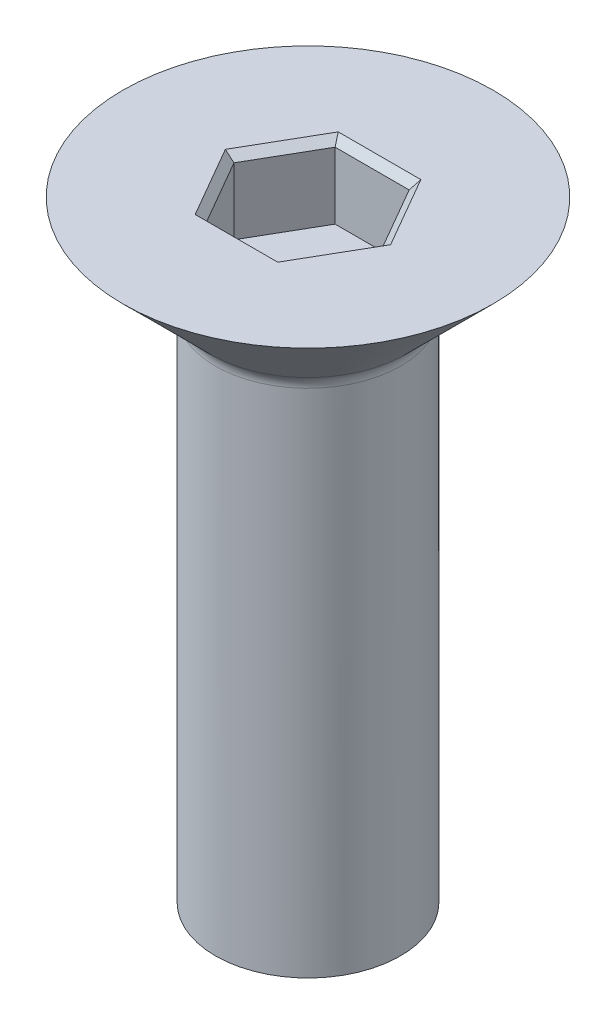
ISO-10303-21;
HEADER;
FILE_DESCRIPTION(('STEP AP214'),'2;1');
FILE_NAME('part.step','',(''),(''),'','','');
FILE_SCHEMA(('AUTOMOTIVE_DESIGN { 1 0 10303 214 1 1 1 1 }'));
ENDSEC;
DATA;
#1=APPLICATION_CONTEXT('core data for automotive mechanical design processes');
#2=APPLICATION_PROTOCOL_DEFINITION('international standard','automotive_design',2000,#1);
#3=PRODUCT_CONTEXT('',#1,'mechanical');
#4=PRODUCT('Part','Part','',(#3));
#5=PRODUCT_RELATED_PRODUCT_CATEGORY('part','',(#4));
#6=PRODUCT_DEFINITION_FORMATION('','',#4);
#7=PRODUCT_DEFINITION_CONTEXT('part definition',#1,'design');
#8=PRODUCT_DEFINITION('design','',#6,#7);
#9=PRODUCT_DEFINITION_SHAPE('','',#8);
#10=(LENGTH_UNIT() NAMED_UNIT(*) SI_UNIT(.MILLI.,.METRE.));
#11=(NAMED_UNIT(*) PLANE_ANGLE_UNIT() SI_UNIT($,.RADIAN.));
#12=(NAMED_UNIT(*) SI_UNIT($,.STERADIAN.) SOLID_ANGLE_UNIT());
#13=UNCERTAINTY_MEASURE_WITH_UNIT(LENGTH_MEASURE(1.E-05),#10,'distance_accuracy_value','');
#14=(GEOMETRIC_REPRESENTATION_CONTEXT(3) GLOBAL_UNCERTAINTY_ASSIGNED_CONTEXT((#13)) GLOBAL_UNIT_ASSIGNED_CONTEXT((#10,
#11,#12)) REPRESENTATION_CONTEXT('',''));
#15=CARTESIAN_POINT('',(0.,0.,0.));
#16=DIRECTION('',(0.,0.,1.));
#17=DIRECTION('',(1.,0.,0.));
#18=AXIS2_PLACEMENT_3D('',#15,#16,#17);
#19=CARTESIAN_POINT('',(0.,14.,0.));
#20=DIRECTION('',(0.,-1.,0.));
#21=DIRECTION('',(0.,0.,-1.));
#22=AXIS2_PLACEMENT_3D('',#19,#20,#21);
#23=CYLINDRICAL_SURFACE('',#22,2.5);
#24=CARTESIAN_POINT('',(0.,13.7928932188135,0.));
#25=DIRECTION('',(0.,1.,0.));
#26=DIRECTION('',(-1.,0.,0.));
#27=AXIS2_PLACEMENT_3D('',#24,#25,#26);
#28=CIRCLE('',#27,2.5);
#29=CARTESIAN_POINT('',(-2.5,13.7928932188135,0.));
#30=VERTEX_POINT('',#29);
#31=EDGE_CURVE('E11',#30,#30,#28,.F.);
#32=ORIENTED_EDGE('',*,*,#31,.T.);
#33=EDGE_LOOP('',(#32));
#34=FACE_BOUND('',#33,.T.);
#35=CARTESIAN_POINT('',(0.,0.,0.));
#36=DIRECTION('',(0.,1.,0.));
#37=DIRECTION('',(0.,0.,1.));
#38=AXIS2_PLACEMENT_3D('',#35,#36,#37);
#39=CIRCLE('',#38,2.5);
#40=CARTESIAN_POINT('',(0.,0.,2.5));
#41=VERTEX_POINT('',#40);
#42=EDGE_CURVE('E157',#41,#41,#39,.T.);
#43=ORIENTED_EDGE('',*,*,#42,.T.);
#44=EDGE_LOOP('',(#43));
#45=FACE_BOUND('',#44,.T.);
#46=ADVANCED_FACE('F38',(#34,#45),#23,.T.);
#47=CARTESIAN_POINT('',(0.,0.,0.));
#48=DIRECTION('',(0.,1.,0.));
#49=DIRECTION('',(0.,0.,1.));
#50=AXIS2_PLACEMENT_3D('',#47,#48,#49);
#51=PLANE('',#50);
#52=ORIENTED_EDGE('',*,*,#42,.F.);
#53=EDGE_LOOP('',(#52));
#54=FACE_BOUND('',#53,.T.);
#55=ADVANCED_FACE('F212',(#54),#51,.F.);
#56=CARTESIAN_POINT('',(-5.,16.5,0.));
#57=DIRECTION('',(0.,-1.,0.));
#58=DIRECTION('',(1.,0.,0.));
#59=AXIS2_PLACEMENT_3D('',#56,#57,#58);
#60=PLANE('',#59);
#61=DIRECTION('',(-0.5,0.,-0.866025403784439));
#62=VECTOR('',#61,1.);
#63=CARTESIAN_POINT('',(-2.9232050807569,16.5,-1.19903810567665));
#64=LINE('',#63,#62);
#65=CARTESIAN_POINT('',(-1.11547005383794,16.5,1.93205080756888));
#66=VERTEX_POINT('',#65);
#67=CARTESIAN_POINT('',(-2.23094010767586,16.5,0.));
#68=VERTEX_POINT('',#67);
#69=EDGE_CURVE('E171',#66,#68,#64,.T.);
#70=ORIENTED_EDGE('',*,*,#69,.T.);
#71=DIRECTION('',(0.5,0.,-0.866025403784439));
#72=VECTOR('',#71,1.);
#73=CARTESIAN_POINT('',(-2.9232050807569,16.5,1.19903810567665));
#74=LINE('',#73,#72);
#75=CARTESIAN_POINT('',(-1.11547005383794,16.5,-1.93205080756888));
#76=VERTEX_POINT('',#75);
#77=EDGE_CURVE('E173',#68,#76,#74,.T.);
#78=ORIENTED_EDGE('',*,*,#77,.T.);
#79=DIRECTION('',(1.,0.,0.));
#80=VECTOR('',#79,1.);
#81=CARTESIAN_POINT('',(-5.,16.5,-1.93205080756888));
#82=LINE('',#81,#80);
#83=CARTESIAN_POINT('',(1.11547005383791,16.5,-1.93205080756888));
#84=VERTEX_POINT('',#83);
#85=EDGE_CURVE('E163',#76,#84,#82,.T.);
#86=ORIENTED_EDGE('',*,*,#85,.T.);
#87=DIRECTION('',(0.5,0.,0.866025403784439));
#88=VECTOR('',#87,1.);
#89=CARTESIAN_POINT('',(0.423205080756877,16.5,-3.13108891324553));
#90=LINE('',#89,#88);
#91=CARTESIAN_POINT('',(2.23094010767584,16.5,0.));
#92=VERTEX_POINT('',#91);
#93=EDGE_CURVE('E165',#84,#92,#90,.T.);
#94=ORIENTED_EDGE('',*,*,#93,.T.);
#95=DIRECTION('',(-0.5,0.,0.866025403784439));
#96=VECTOR('',#95,1.);
#97=CARTESIAN_POINT('',(0.423205080756878,16.5,3.13108891324553));
#98=LINE('',#97,#96);
#99=CARTESIAN_POINT('',(1.11547005383791,16.5,1.93205080756888));
#100=VERTEX_POINT('',#99);
#101=EDGE_CURVE('E167',#92,#100,#98,.T.);
#102=ORIENTED_EDGE('',*,*,#101,.T.);
#103=DIRECTION('',(-1.,0.,0.));
#104=VECTOR('',#103,1.);
#105=CARTESIAN_POINT('',(-5.,16.5,1.93205080756888));
#106=LINE('',#105,#104);
#107=EDGE_CURVE('E169',#100,#66,#106,.T.);
#108=ORIENTED_EDGE('',*,*,#107,.T.);
#109=EDGE_LOOP('',(#70,#78,#86,#94,#102,#108));
#110=FACE_BOUND('',#109,.T.);
#111=CARTESIAN_POINT('',(0.,16.5,0.));
#112=DIRECTION('',(0.,-1.,0.));
#113=DIRECTION('',(1.,0.,0.));
#114=AXIS2_PLACEMENT_3D('',#111,#112,#113);
#115=CIRCLE('',#114,5.);
#116=CARTESIAN_POINT('',(5.,16.5,0.));
#117=VERTEX_POINT('',#116);
#118=EDGE_CURVE('E144',#117,#117,#115,.T.);
#119=ORIENTED_EDGE('',*,*,#118,.F.);
#120=EDGE_LOOP('',(#119));
#121=FACE_BOUND('',#120,.T.);
#122=ADVANCED_FACE('F218',(#110,#121),#60,.F.);
#123=CARTESIAN_POINT('',(0.,16.5,0.));
#124=DIRECTION('',(0.,1.,0.));
#125=DIRECTION('',(-1.,0.,0.));
#126=AXIS2_PLACEMENT_3D('',#123,#124,#125);
#127=CONICAL_SURFACE('',#126,5.,0.785398163397447);
#128=CARTESIAN_POINT('',(0.,14.1464466094067,0.));
#129=DIRECTION('',(0.,1.,0.));
#130=DIRECTION('',(-1.,0.,0.));
#131=AXIS2_PLACEMENT_3D('',#128,#129,#130);
#132=CIRCLE('',#131,2.64644660940673);
#133=CARTESIAN_POINT('',(-2.64644660940673,14.1464466094067,0.));
#134=VERTEX_POINT('',#133);
#135=EDGE_CURVE('E46',#134,#134,#132,.T.);
#136=ORIENTED_EDGE('',*,*,#135,.T.);
#137=EDGE_LOOP('',(#136));
#138=FACE_BOUND('',#137,.T.);
#139=ORIENTED_EDGE('',*,*,#118,.T.);
#140=EDGE_LOOP('',(#139));
#141=FACE_BOUND('',#140,.T.);
#142=ADVANCED_FACE('F198',(#138,#141),#127,.T.);
#143=CARTESIAN_POINT('',(0.99999999999999,14.5,1.73205080756888));
#144=DIRECTION('',(0.866025403784439,0.,0.5));
#145=DIRECTION('',(0.5,0.,-0.866025403784439));
#146=AXIS2_PLACEMENT_3D('',#143,#144,#145);
#147=PLANE('',#146);
#148=DIRECTION('',(0.,1.,0.));
#149=VECTOR('',#148,1.);
#150=CARTESIAN_POINT('',(0.99999999999999,14.5,1.73205080756888));
#151=LINE('',#150,#149);
#152=CARTESIAN_POINT('',(0.99999999999999,14.5,1.73205080756888));
#153=VERTEX_POINT('',#152);
#154=CARTESIAN_POINT('',(0.999999999999989,16.3,1.73205080756888));
#155=VERTEX_POINT('',#154);
#156=EDGE_CURVE('E142',#153,#155,#151,.T.);
#157=ORIENTED_EDGE('',*,*,#156,.T.);
#158=DIRECTION('',(0.5,0.,-0.866025403784439));
#159=VECTOR('',#158,1.);
#160=CARTESIAN_POINT('',(0.999999999999989,16.3,1.73205080756888));
#161=LINE('',#160,#159);
#162=CARTESIAN_POINT('',(1.99999999999999,16.3,0.));
#163=VERTEX_POINT('',#162);
#164=EDGE_CURVE('E61',#155,#163,#161,.T.);
#165=ORIENTED_EDGE('',*,*,#164,.T.);
#166=DIRECTION('',(0.,1.,0.));
#167=VECTOR('',#166,1.);
#168=CARTESIAN_POINT('',(1.99999999999999,14.5,0.));
#169=LINE('',#168,#167);
#170=CARTESIAN_POINT('',(1.99999999999999,14.5,0.));
#171=VERTEX_POINT('',#170);
#172=EDGE_CURVE('E108',#171,#163,#169,.T.);
#173=ORIENTED_EDGE('',*,*,#172,.F.);
#174=DIRECTION('',(0.5,0.,-0.866025403784439));
#175=VECTOR('',#174,1.);
#176=CARTESIAN_POINT('',(0.99999999999999,14.5,1.73205080756888));
#177=LINE('',#176,#175);
#178=EDGE_CURVE('E112',#153,#171,#177,.T.);
#179=ORIENTED_EDGE('',*,*,#178,.F.);
#180=EDGE_LOOP('',(#157,#165,#173,#179));
#181=FACE_BOUND('',#180,.T.);
#182=ADVANCED_FACE('F110',(#181),#147,.F.);
#183=CARTESIAN_POINT('',(-1.00000000000001,14.5,1.73205080756888));
#184=DIRECTION('',(0.,0.,1.));
#185=DIRECTION('',(1.,0.,0.));
#186=AXIS2_PLACEMENT_3D('',#183,#184,#185);
#187=PLANE('',#186);
#188=DIRECTION('',(0.,1.,0.));
#189=VECTOR('',#188,1.);
#190=CARTESIAN_POINT('',(-1.00000000000001,14.5,1.73205080756888));
#191=LINE('',#190,#189);
#192=CARTESIAN_POINT('',(-1.00000000000001,14.5,1.73205080756888));
#193=VERTEX_POINT('',#192);
#194=CARTESIAN_POINT('',(-1.00000000000001,16.3,1.73205080756888));
#195=VERTEX_POINT('',#194);
#196=EDGE_CURVE('E145',#193,#195,#191,.T.);
#197=ORIENTED_EDGE('',*,*,#196,.T.);
#198=DIRECTION('',(1.,0.,0.));
#199=VECTOR('',#198,1.);
#200=CARTESIAN_POINT('',(-1.00000000000001,16.3,1.73205080756888));
#201=LINE('',#200,#199);
#202=EDGE_CURVE('E178',#195,#155,#201,.T.);
#203=ORIENTED_EDGE('',*,*,#202,.T.);
#204=ORIENTED_EDGE('',*,*,#156,.F.);
#205=DIRECTION('',(1.,0.,0.));
#206=VECTOR('',#205,1.);
#207=CARTESIAN_POINT('',(-1.00000000000001,14.5,1.73205080756888));
#208=LINE('',#207,#206);
#209=EDGE_CURVE('E116',#193,#153,#208,.T.);
#210=ORIENTED_EDGE('',*,*,#209,.F.);
#211=EDGE_LOOP('',(#197,#203,#204,#210));
#212=FACE_BOUND('',#211,.T.);
#213=ADVANCED_FACE('F286',(#212),#187,.F.);
#214=CARTESIAN_POINT('',(-2.00000000000001,14.5,0.));
#215=DIRECTION('',(-0.866025403784439,0.,0.5));
#216=DIRECTION('',(0.5,0.,0.866025403784439));
#217=AXIS2_PLACEMENT_3D('',#214,#215,#216);
#218=PLANE('',#217);
#219=DIRECTION('',(0.,1.,0.));
#220=VECTOR('',#219,1.);
#221=CARTESIAN_POINT('',(-2.00000000000001,14.5,0.));
#222=LINE('',#221,#220);
#223=CARTESIAN_POINT('',(-2.00000000000001,14.5,0.));
#224=VERTEX_POINT('',#223);
#225=CARTESIAN_POINT('',(-2.00000000000001,16.3,0.));
#226=VERTEX_POINT('',#225);
#227=EDGE_CURVE('E148',#224,#226,#222,.T.);
#228=ORIENTED_EDGE('',*,*,#227,.T.);
#229=DIRECTION('',(0.5,0.,0.866025403784439));
#230=VECTOR('',#229,1.);
#231=CARTESIAN_POINT('',(-2.00000000000001,16.3,0.));
#232=LINE('',#231,#230);
#233=EDGE_CURVE('E176',#226,#195,#232,.T.);
#234=ORIENTED_EDGE('',*,*,#233,.T.);
#235=ORIENTED_EDGE('',*,*,#196,.F.);
#236=DIRECTION('',(0.5,0.,0.866025403784439));
#237=VECTOR('',#236,1.);
#238=CARTESIAN_POINT('',(-2.00000000000001,14.5,0.));
#239=LINE('',#238,#237);
#240=EDGE_CURVE('E139',#224,#193,#239,.T.);
#241=ORIENTED_EDGE('',*,*,#240,.F.);
#242=EDGE_LOOP('',(#228,#234,#235,#241));
#243=FACE_BOUND('',#242,.T.);
#244=ADVANCED_FACE('F289',(#243),#218,.F.);
#245=CARTESIAN_POINT('',(-1.00000000000001,14.5,-1.73205080756888));
#246=DIRECTION('',(-0.866025403784439,0.,-0.5));
#247=DIRECTION('',(-0.5,0.,0.866025403784439));
#248=AXIS2_PLACEMENT_3D('',#245,#246,#247);
#249=PLANE('',#248);
#250=DIRECTION('',(0.,1.,0.));
#251=VECTOR('',#250,1.);
#252=CARTESIAN_POINT('',(-1.00000000000001,14.5,-1.73205080756888));
#253=LINE('',#252,#251);
#254=CARTESIAN_POINT('',(-1.00000000000001,14.5,-1.73205080756888));
#255=VERTEX_POINT('',#254);
#256=CARTESIAN_POINT('',(-1.00000000000001,16.3,-1.73205080756888));
#257=VERTEX_POINT('',#256);
#258=EDGE_CURVE('E151',#255,#257,#253,.T.);
#259=ORIENTED_EDGE('',*,*,#258,.T.);
#260=DIRECTION('',(-0.5,0.,0.866025403784439));
#261=VECTOR('',#260,1.);
#262=CARTESIAN_POINT('',(-1.00000000000001,16.3,-1.73205080756888));
#263=LINE('',#262,#261);
#264=EDGE_CURVE('E160',#257,#226,#263,.T.);
#265=ORIENTED_EDGE('',*,*,#264,.T.);
#266=ORIENTED_EDGE('',*,*,#227,.F.);
#267=DIRECTION('',(-0.5,0.,0.866025403784439));
#268=VECTOR('',#267,1.);
#269=CARTESIAN_POINT('',(-1.00000000000001,14.5,-1.73205080756888));
#270=LINE('',#269,#268);
#271=EDGE_CURVE('E136',#255,#224,#270,.T.);
#272=ORIENTED_EDGE('',*,*,#271,.F.);
#273=EDGE_LOOP('',(#259,#265,#266,#272));
#274=FACE_BOUND('',#273,.T.);
#275=ADVANCED_FACE('F282',(#274),#249,.F.);
#276=CARTESIAN_POINT('',(0.999999999999989,14.5,-1.73205080756888));
#277=DIRECTION('',(0.,0.,-1.));
#278=DIRECTION('',(-1.,0.,0.));
#279=AXIS2_PLACEMENT_3D('',#276,#277,#278);
#280=PLANE('',#279);
#281=DIRECTION('',(0.,1.,0.));
#282=VECTOR('',#281,1.);
#283=CARTESIAN_POINT('',(0.999999999999989,14.5,-1.73205080756888));
#284=LINE('',#283,#282);
#285=CARTESIAN_POINT('',(0.999999999999989,14.5,-1.73205080756888));
#286=VERTEX_POINT('',#285);
#287=CARTESIAN_POINT('',(0.999999999999988,16.3,-1.73205080756888));
#288=VERTEX_POINT('',#287);
#289=EDGE_CURVE('E115',#286,#288,#284,.T.);
#290=ORIENTED_EDGE('',*,*,#289,.T.);
#291=DIRECTION('',(-1.,0.,0.));
#292=VECTOR('',#291,1.);
#293=CARTESIAN_POINT('',(0.999999999999988,16.3,-1.73205080756888));
#294=LINE('',#293,#292);
#295=EDGE_CURVE('E182',#288,#257,#294,.T.);
#296=ORIENTED_EDGE('',*,*,#295,.T.);
#297=ORIENTED_EDGE('',*,*,#258,.F.);
#298=DIRECTION('',(-1.,0.,0.));
#299=VECTOR('',#298,1.);
#300=CARTESIAN_POINT('',(0.999999999999989,14.5,-1.73205080756888));
#301=LINE('',#300,#299);
#302=EDGE_CURVE('E124',#286,#255,#301,.T.);
#303=ORIENTED_EDGE('',*,*,#302,.F.);
#304=EDGE_LOOP('',(#290,#296,#297,#303));
#305=FACE_BOUND('',#304,.T.);
#306=ADVANCED_FACE('F279',(#305),#280,.F.);
#307=CARTESIAN_POINT('',(1.99999999999999,14.5,0.));
#308=DIRECTION('',(0.866025403784438,0.,-0.5));
#309=DIRECTION('',(-0.5,0.,-0.866025403784439));
#310=AXIS2_PLACEMENT_3D('',#307,#308,#309);
#311=PLANE('',#310);
#312=ORIENTED_EDGE('',*,*,#172,.T.);
#313=DIRECTION('',(-0.5,0.,-0.866025403784439));
#314=VECTOR('',#313,1.);
#315=CARTESIAN_POINT('',(1.99999999999999,16.3,0.));
#316=LINE('',#315,#314);
#317=EDGE_CURVE('E53',#163,#288,#316,.T.);
#318=ORIENTED_EDGE('',*,*,#317,.T.);
#319=ORIENTED_EDGE('',*,*,#289,.F.);
#320=DIRECTION('',(-0.5,0.,-0.866025403784438));
#321=VECTOR('',#320,1.);
#322=CARTESIAN_POINT('',(1.99999999999999,14.5,0.));
#323=LINE('',#322,#321);
#324=EDGE_CURVE('E119',#171,#286,#323,.T.);
#325=ORIENTED_EDGE('',*,*,#324,.F.);
#326=EDGE_LOOP('',(#312,#318,#319,#325));
#327=FACE_BOUND('',#326,.T.);
#328=ADVANCED_FACE('F120',(#327),#311,.F.);
#329=CARTESIAN_POINT('',(0.,14.5,0.));
#330=DIRECTION('',(0.,1.,0.));
#331=DIRECTION('',(0.,0.,1.));
#332=AXIS2_PLACEMENT_3D('',#329,#330,#331);
#333=PLANE('',#332);
#334=ORIENTED_EDGE('',*,*,#178,.T.);
#335=ORIENTED_EDGE('',*,*,#324,.T.);
#336=ORIENTED_EDGE('',*,*,#302,.T.);
#337=ORIENTED_EDGE('',*,*,#271,.T.);
#338=ORIENTED_EDGE('',*,*,#240,.T.);
#339=ORIENTED_EDGE('',*,*,#209,.T.);
#340=EDGE_LOOP('',(#334,#335,#336,#337,#338,#339));
#341=FACE_BOUND('',#340,.T.);
#342=ADVANCED_FACE('F126',(#341),#333,.T.);
#343=CARTESIAN_POINT('',(0.999999999999989,16.3,1.73205080756888));
#344=DIRECTION('',(0.612372435695791,-0.707106781186552,0.353553390593271));
#345=DIRECTION('',(0.5,0.,-0.866025403784439));
#346=AXIS2_PLACEMENT_3D('',#343,#344,#345);
#347=PLANE('',#346);
#348=DIRECTION('',(0.377964473009226,0.654653670707971,0.654653670707984));
#349=VECTOR('',#348,1.);
#350=CARTESIAN_POINT('',(0.714285714285706,15.8051283406946,1.23717914826348));
#351=LINE('',#350,#349);
#352=EDGE_CURVE('E132',#100,#155,#351,.F.);
#353=ORIENTED_EDGE('',*,*,#352,.F.);
#354=ORIENTED_EDGE('',*,*,#101,.F.);
#355=DIRECTION('',(0.755928946018458,0.654653670707973,0.));
#356=VECTOR('',#355,1.);
#357=CARTESIAN_POINT('',(1.42857142857141,15.8051283406946,0.));
#358=LINE('',#357,#356);
#359=EDGE_CURVE('E129',#163,#92,#358,.T.);
#360=ORIENTED_EDGE('',*,*,#359,.F.);
#361=ORIENTED_EDGE('',*,*,#164,.F.);
#362=EDGE_LOOP('',(#353,#354,#360,#361));
#363=FACE_BOUND('',#362,.T.);
#364=ADVANCED_FACE('F253',(#363),#347,.F.);
#365=CARTESIAN_POINT('',(1.99999999999999,16.3,0.));
#366=DIRECTION('',(0.612372435695791,-0.707106781186552,-0.353553390593272));
#367=DIRECTION('',(-0.5,0.,-0.866025403784439));
#368=AXIS2_PLACEMENT_3D('',#365,#366,#367);
#369=PLANE('',#368);
#370=ORIENTED_EDGE('',*,*,#359,.T.);
#371=ORIENTED_EDGE('',*,*,#93,.F.);
#372=DIRECTION('',(0.377964473009229,0.654653670707972,-0.654653670707981));
#373=VECTOR('',#372,1.);
#374=CARTESIAN_POINT('',(0.7142857142857,15.8051283406946,-1.23717914826348));
#375=LINE('',#374,#373);
#376=EDGE_CURVE('E191',#288,#84,#375,.T.);
#377=ORIENTED_EDGE('',*,*,#376,.F.);
#378=ORIENTED_EDGE('',*,*,#317,.F.);
#379=EDGE_LOOP('',(#370,#371,#377,#378));
#380=FACE_BOUND('',#379,.T.);
#381=ADVANCED_FACE('F247',(#380),#369,.F.);
#382=CARTESIAN_POINT('',(-1.00000000000001,16.3,1.73205080756888));
#383=DIRECTION('',(0.,-0.707106781186555,0.70710678118654));
#384=DIRECTION('',(1.,0.,0.));
#385=AXIS2_PLACEMENT_3D('',#382,#383,#384);
#386=PLANE('',#385);
#387=ORIENTED_EDGE('',*,*,#352,.T.);
#388=ORIENTED_EDGE('',*,*,#202,.F.);
#389=DIRECTION('',(-0.377964473009239,0.654653670707967,0.654653670707981));
#390=VECTOR('',#389,1.);
#391=CARTESIAN_POINT('',(-0.714285714285719,15.8051283406946,1.23717914826349));
#392=LINE('',#391,#390);
#393=EDGE_CURVE('E188',#66,#195,#392,.F.);
#394=ORIENTED_EDGE('',*,*,#393,.F.);
#395=ORIENTED_EDGE('',*,*,#107,.F.);
#396=EDGE_LOOP('',(#387,#388,#394,#395));
#397=FACE_BOUND('',#396,.T.);
#398=ADVANCED_FACE('F240',(#397),#386,.F.);
#399=CARTESIAN_POINT('',(0.999999999999988,16.3,-1.73205080756888));
#400=DIRECTION('',(0.,-0.707106781186552,-0.707106781186543));
#401=DIRECTION('',(-1.,0.,0.));
#402=AXIS2_PLACEMENT_3D('',#399,#400,#401);
#403=PLANE('',#402);
#404=ORIENTED_EDGE('',*,*,#376,.T.);
#405=ORIENTED_EDGE('',*,*,#85,.F.);
#406=DIRECTION('',(0.377964473009241,-0.654653670707969,0.654653670707978));
#407=VECTOR('',#406,1.);
#408=CARTESIAN_POINT('',(-1.00000000000001,16.3,-1.73205080756888));
#409=LINE('',#408,#407);
#410=EDGE_CURVE('E186',#257,#76,#409,.F.);
#411=ORIENTED_EDGE('',*,*,#410,.F.);
#412=ORIENTED_EDGE('',*,*,#295,.F.);
#413=EDGE_LOOP('',(#404,#405,#411,#412));
#414=FACE_BOUND('',#413,.T.);
#415=ADVANCED_FACE('F233',(#414),#403,.F.);
#416=CARTESIAN_POINT('',(-2.00000000000001,16.3,0.));
#417=DIRECTION('',(-0.612372435695784,-0.707106781186559,0.353553390593268));
#418=DIRECTION('',(0.5,0.,0.866025403784439));
#419=AXIS2_PLACEMENT_3D('',#416,#417,#418);
#420=PLANE('',#419);
#421=ORIENTED_EDGE('',*,*,#393,.T.);
#422=ORIENTED_EDGE('',*,*,#233,.F.);
#423=DIRECTION('',(-0.755928946018465,0.654653670707965,0.));
#424=VECTOR('',#423,1.);
#425=CARTESIAN_POINT('',(-1.42857142857142,15.8051283406946,0.));
#426=LINE('',#425,#424);
#427=EDGE_CURVE('E184',#68,#226,#426,.F.);
#428=ORIENTED_EDGE('',*,*,#427,.F.);
#429=ORIENTED_EDGE('',*,*,#69,.F.);
#430=EDGE_LOOP('',(#421,#422,#428,#429));
#431=FACE_BOUND('',#430,.T.);
#432=ADVANCED_FACE('F207',(#431),#420,.F.);
#433=CARTESIAN_POINT('',(-1.00000000000001,16.3,-1.73205080756888));
#434=DIRECTION('',(-0.612372435695785,-0.707106781186559,-0.353553390593268));
#435=DIRECTION('',(-0.5,0.,0.866025403784439));
#436=AXIS2_PLACEMENT_3D('',#433,#434,#435);
#437=PLANE('',#436);
#438=ORIENTED_EDGE('',*,*,#410,.T.);
#439=ORIENTED_EDGE('',*,*,#77,.F.);
#440=ORIENTED_EDGE('',*,*,#427,.T.);
#441=ORIENTED_EDGE('',*,*,#264,.F.);
#442=EDGE_LOOP('',(#438,#439,#440,#441));
#443=FACE_BOUND('',#442,.T.);
#444=ADVANCED_FACE('F202',(#443),#437,.F.);
#445=CARTESIAN_POINT('',(0.,13.7928932188135,0.));
#446=DIRECTION('',(0.,1.,0.));
#447=DIRECTION('',(-1.,0.,0.));
#448=AXIS2_PLACEMENT_3D('',#445,#446,#447);
#449=TOROIDAL_SURFACE('',#448,3.,0.5);
#450=ORIENTED_EDGE('',*,*,#31,.F.);
#451=EDGE_LOOP('',(#450));
#452=FACE_BOUND('',#451,.T.);
#453=ORIENTED_EDGE('',*,*,#135,.F.);
#454=EDGE_LOOP('',(#453));
#455=FACE_BOUND('',#454,.T.);
#456=ADVANCED_FACE('F40',(#452,#455),#449,.F.);
#457=CLOSED_SHELL('',(#46,#55,#122,#142,#182,#213,#244,#275,#306,#328,#342,#364,#381,#398,#415,
#432,#444,#456));
#458=MANIFOLD_SOLID_BREP('B2',#457);
#459=ADVANCED_BREP_SHAPE_REPRESENTATION('',(#18,#458),#14);
#460=SHAPE_DEFINITION_REPRESENTATION(#9,#459);
ENDSEC;
END-ISO-10303-21;
